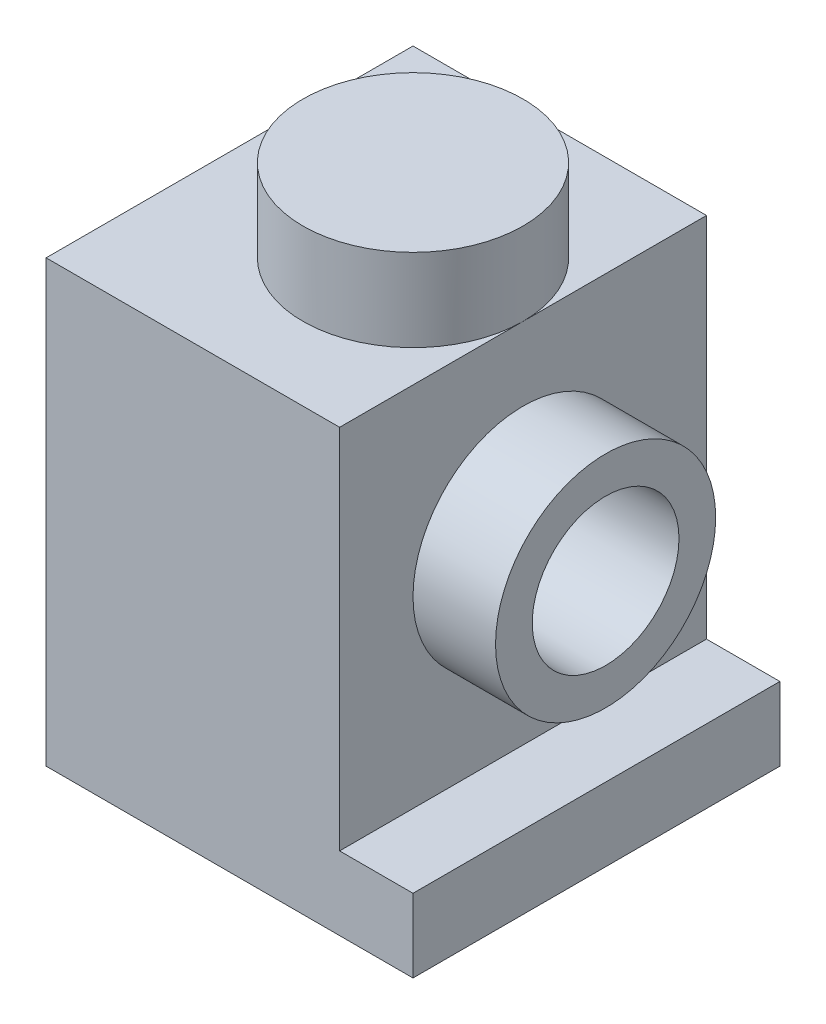
ISO-10303-21;
HEADER;
FILE_DESCRIPTION(('STEP AP214'),'2;1');
FILE_NAME('part.step','',(''),(''),'','','');
FILE_SCHEMA(('AUTOMOTIVE_DESIGN { 1 0 10303 214 1 1 1 1 }'));
ENDSEC;
DATA;
#1=APPLICATION_CONTEXT('core data for automotive mechanical design processes');
#2=APPLICATION_PROTOCOL_DEFINITION('international standard','automotive_design',2000,#1);
#3=PRODUCT_CONTEXT('',#1,'mechanical');
#4=PRODUCT('Part','Part','',(#3));
#5=PRODUCT_RELATED_PRODUCT_CATEGORY('part','',(#4));
#6=PRODUCT_DEFINITION_FORMATION('','',#4);
#7=PRODUCT_DEFINITION_CONTEXT('part definition',#1,'design');
#8=PRODUCT_DEFINITION('design','',#6,#7);
#9=PRODUCT_DEFINITION_SHAPE('','',#8);
#10=(LENGTH_UNIT() NAMED_UNIT(*) SI_UNIT(.MILLI.,.METRE.));
#11=(NAMED_UNIT(*) PLANE_ANGLE_UNIT() SI_UNIT($,.RADIAN.));
#12=(NAMED_UNIT(*) SI_UNIT($,.STERADIAN.) SOLID_ANGLE_UNIT());
#13=UNCERTAINTY_MEASURE_WITH_UNIT(LENGTH_MEASURE(1.E-05),#10,'distance_accuracy_value','');
#14=(GEOMETRIC_REPRESENTATION_CONTEXT(3) GLOBAL_UNCERTAINTY_ASSIGNED_CONTEXT((#13)) GLOBAL_UNIT_ASSIGNED_CONTEXT((#10,
#11,#12)) REPRESENTATION_CONTEXT('',''));
#15=CARTESIAN_POINT('',(0.,0.,0.));
#16=DIRECTION('',(0.,0.,1.));
#17=DIRECTION('',(1.,0.,0.));
#18=AXIS2_PLACEMENT_3D('',#15,#16,#17);
#19=CARTESIAN_POINT('',(-4.8,5.6,0.));
#20=DIRECTION('',(1.,0.,0.));
#21=DIRECTION('',(0.,0.,-1.));
#22=AXIS2_PLACEMENT_3D('',#19,#20,#21);
#23=CYLINDRICAL_SURFACE('',#22,1.6);
#24=CARTESIAN_POINT('',(4.2,5.6,0.));
#25=DIRECTION('',(1.,0.,0.));
#26=DIRECTION('',(0.,0.,-1.));
#27=AXIS2_PLACEMENT_3D('',#24,#25,#26);
#28=CIRCLE('',#27,1.6);
#29=CARTESIAN_POINT('',(4.2,5.6,-1.60000000000009));
#30=VERTEX_POINT('',#29);
#31=EDGE_CURVE('E156',#30,#30,#28,.T.);
#32=ORIENTED_EDGE('',*,*,#31,.T.);
#33=EDGE_LOOP('',(#32));
#34=FACE_BOUND('',#33,.T.);
#35=CARTESIAN_POINT('',(1.,5.6,0.));
#36=DIRECTION('',(-1.,0.,0.));
#37=DIRECTION('',(0.,0.,1.));
#38=AXIS2_PLACEMENT_3D('',#35,#36,#37);
#39=CIRCLE('',#38,1.6);
#40=CARTESIAN_POINT('',(1.,5.6,1.5999999999999));
#41=VERTEX_POINT('',#40);
#42=EDGE_CURVE('E37',#41,#41,#39,.F.);
#43=ORIENTED_EDGE('',*,*,#42,.F.);
#44=EDGE_LOOP('',(#43));
#45=FACE_BOUND('',#44,.T.);
#46=ADVANCED_FACE('F33',(#34,#45),#23,.F.);
#47=CARTESIAN_POINT('',(4.,9.6,4.));
#48=DIRECTION('',(-1.,0.,0.));
#49=DIRECTION('',(0.,0.,1.));
#50=AXIS2_PLACEMENT_3D('',#47,#48,#49);
#51=PLANE('',#50);
#52=DIRECTION('',(0.,0.,-1.));
#53=VECTOR('',#52,1.);
#54=CARTESIAN_POINT('',(4.,1.6,-4.));
#55=LINE('',#54,#53);
#56=CARTESIAN_POINT('',(4.,1.6,4.));
#57=VERTEX_POINT('',#56);
#58=CARTESIAN_POINT('',(4.,1.6,-4.));
#59=VERTEX_POINT('',#58);
#60=EDGE_CURVE('E172',#57,#59,#55,.T.);
#61=ORIENTED_EDGE('',*,*,#60,.F.);
#62=DIRECTION('',(0.,-1.,0.));
#63=VECTOR('',#62,1.);
#64=CARTESIAN_POINT('',(4.,9.6,4.));
#65=LINE('',#64,#63);
#66=CARTESIAN_POINT('',(4.,0.,4.));
#67=VERTEX_POINT('',#66);
#68=EDGE_CURVE('E206',#57,#67,#65,.T.);
#69=ORIENTED_EDGE('',*,*,#68,.T.);
#70=DIRECTION('',(0.,0.,-1.));
#71=VECTOR('',#70,1.);
#72=CARTESIAN_POINT('',(4.,0.,4.));
#73=LINE('',#72,#71);
#74=CARTESIAN_POINT('',(4.,0.,-4.));
#75=VERTEX_POINT('',#74);
#76=EDGE_CURVE('E198',#67,#75,#73,.T.);
#77=ORIENTED_EDGE('',*,*,#76,.T.);
#78=DIRECTION('',(0.,-1.,0.));
#79=VECTOR('',#78,1.);
#80=CARTESIAN_POINT('',(4.,9.6,-4.));
#81=LINE('',#80,#79);
#82=EDGE_CURVE('E204',#59,#75,#81,.T.);
#83=ORIENTED_EDGE('',*,*,#82,.F.);
#84=EDGE_LOOP('',(#61,#69,#77,#83));
#85=FACE_BOUND('',#84,.T.);
#86=ADVANCED_FACE('F225',(#85),#51,.F.);
#87=CARTESIAN_POINT('',(-4.,9.6,4.));
#88=DIRECTION('',(1.,0.,0.));
#89=DIRECTION('',(0.,0.,-1.));
#90=AXIS2_PLACEMENT_3D('',#87,#88,#89);
#91=PLANE('',#90);
#92=DIRECTION('',(0.,0.,1.));
#93=VECTOR('',#92,1.);
#94=CARTESIAN_POINT('',(-4.,3.19828034728268,2.39999999999981));
#95=LINE('',#94,#93);
#96=CARTESIAN_POINT('',(-4.,3.19828034728268,-2.4));
#97=VERTEX_POINT('',#96);
#98=CARTESIAN_POINT('',(-4.,3.19828034728268,2.39999999999981));
#99=VERTEX_POINT('',#98);
#100=EDGE_CURVE('E144',#97,#99,#95,.T.);
#101=ORIENTED_EDGE('',*,*,#100,.F.);
#102=DIRECTION('',(0.,-1.,0.));
#103=VECTOR('',#102,1.);
#104=CARTESIAN_POINT('',(-4.,3.19828034728268,-2.4));
#105=LINE('',#104,#103);
#106=CARTESIAN_POINT('',(-4.,8.00171965271731,-2.4));
#107=VERTEX_POINT('',#106);
#108=EDGE_CURVE('E49',#107,#97,#105,.T.);
#109=ORIENTED_EDGE('',*,*,#108,.F.);
#110=DIRECTION('',(0.,0.,-1.));
#111=VECTOR('',#110,1.);
#112=CARTESIAN_POINT('',(-4.,8.00171965271731,2.39999999999981));
#113=LINE('',#112,#111);
#114=CARTESIAN_POINT('',(-4.,8.00171965271731,2.39999999999981));
#115=VERTEX_POINT('',#114);
#116=EDGE_CURVE('E135',#115,#107,#113,.T.);
#117=ORIENTED_EDGE('',*,*,#116,.F.);
#118=DIRECTION('',(0.,1.,0.));
#119=VECTOR('',#118,1.);
#120=CARTESIAN_POINT('',(-4.,3.19828034728268,2.39999999999981));
#121=LINE('',#120,#119);
#122=EDGE_CURVE('E138',#99,#115,#121,.T.);
#123=ORIENTED_EDGE('',*,*,#122,.F.);
#124=EDGE_LOOP('',(#101,#109,#117,#123));
#125=FACE_BOUND('',#124,.T.);
#126=DIRECTION('',(0.,0.,1.));
#127=VECTOR('',#126,1.);
#128=CARTESIAN_POINT('',(-4.,0.,4.));
#129=LINE('',#128,#127);
#130=CARTESIAN_POINT('',(-4.,0.,-4.));
#131=VERTEX_POINT('',#130);
#132=CARTESIAN_POINT('',(-4.,0.,4.));
#133=VERTEX_POINT('',#132);
#134=EDGE_CURVE('E180',#131,#133,#129,.T.);
#135=ORIENTED_EDGE('',*,*,#134,.T.);
#136=DIRECTION('',(0.,-1.,0.));
#137=VECTOR('',#136,1.);
#138=CARTESIAN_POINT('',(-4.,9.6,4.));
#139=LINE('',#138,#137);
#140=CARTESIAN_POINT('',(-4.,9.6,4.));
#141=VERTEX_POINT('',#140);
#142=EDGE_CURVE('E42',#141,#133,#139,.T.);
#143=ORIENTED_EDGE('',*,*,#142,.F.);
#144=DIRECTION('',(0.,0.,1.));
#145=VECTOR('',#144,1.);
#146=CARTESIAN_POINT('',(-4.,9.6,4.));
#147=LINE('',#146,#145);
#148=CARTESIAN_POINT('',(-4.,9.6,-4.));
#149=VERTEX_POINT('',#148);
#150=EDGE_CURVE('E183',#149,#141,#147,.T.);
#151=ORIENTED_EDGE('',*,*,#150,.F.);
#152=DIRECTION('',(0.,-1.,0.));
#153=VECTOR('',#152,1.);
#154=CARTESIAN_POINT('',(-4.,9.6,-4.));
#155=LINE('',#154,#153);
#156=EDGE_CURVE('E192',#149,#131,#155,.T.);
#157=ORIENTED_EDGE('',*,*,#156,.T.);
#158=EDGE_LOOP('',(#135,#143,#151,#157));
#159=FACE_BOUND('',#158,.T.);
#160=ADVANCED_FACE('F35',(#125,#159),#91,.F.);
#161=CARTESIAN_POINT('',(4.,9.6,4.));
#162=DIRECTION('',(0.,0.,-1.));
#163=DIRECTION('',(-1.,0.,0.));
#164=AXIS2_PLACEMENT_3D('',#161,#162,#163);
#165=PLANE('',#164);
#166=DIRECTION('',(1.,0.,0.));
#167=VECTOR('',#166,1.);
#168=CARTESIAN_POINT('',(2.4,1.6,4.));
#169=LINE('',#168,#167);
#170=CARTESIAN_POINT('',(2.4,1.6,4.));
#171=VERTEX_POINT('',#170);
#172=EDGE_CURVE('E169',#171,#57,#169,.T.);
#173=ORIENTED_EDGE('',*,*,#172,.F.);
#174=DIRECTION('',(0.,1.,0.));
#175=VECTOR('',#174,1.);
#176=CARTESIAN_POINT('',(2.4,1.6,4.));
#177=LINE('',#176,#175);
#178=CARTESIAN_POINT('',(2.4,9.6,4.));
#179=VERTEX_POINT('',#178);
#180=EDGE_CURVE('E177',#171,#179,#177,.T.);
#181=ORIENTED_EDGE('',*,*,#180,.T.);
#182=DIRECTION('',(1.,0.,0.));
#183=VECTOR('',#182,1.);
#184=CARTESIAN_POINT('',(4.,9.6,4.));
#185=LINE('',#184,#183);
#186=EDGE_CURVE('E186',#141,#179,#185,.T.);
#187=ORIENTED_EDGE('',*,*,#186,.F.);
#188=ORIENTED_EDGE('',*,*,#142,.T.);
#189=DIRECTION('',(1.,0.,0.));
#190=VECTOR('',#189,1.);
#191=CARTESIAN_POINT('',(4.,0.,4.));
#192=LINE('',#191,#190);
#193=EDGE_CURVE('E195',#133,#67,#192,.T.);
#194=ORIENTED_EDGE('',*,*,#193,.T.);
#195=ORIENTED_EDGE('',*,*,#68,.F.);
#196=EDGE_LOOP('',(#173,#181,#187,#188,#194,#195));
#197=FACE_BOUND('',#196,.T.);
#198=ADVANCED_FACE('F212',(#197),#165,.F.);
#199=CARTESIAN_POINT('',(4.,9.6,-4.));
#200=DIRECTION('',(0.,0.,1.));
#201=DIRECTION('',(1.,0.,0.));
#202=AXIS2_PLACEMENT_3D('',#199,#200,#201);
#203=PLANE('',#202);
#204=DIRECTION('',(-1.,0.,0.));
#205=VECTOR('',#204,1.);
#206=CARTESIAN_POINT('',(4.,9.6,-4.));
#207=LINE('',#206,#205);
#208=CARTESIAN_POINT('',(2.4,9.6,-4.));
#209=VERTEX_POINT('',#208);
#210=EDGE_CURVE('E190',#209,#149,#207,.T.);
#211=ORIENTED_EDGE('',*,*,#210,.F.);
#212=DIRECTION('',(0.,1.,0.));
#213=VECTOR('',#212,1.);
#214=CARTESIAN_POINT('',(2.4,1.6,-4.));
#215=LINE('',#214,#213);
#216=CARTESIAN_POINT('',(2.4,1.6,-4.));
#217=VERTEX_POINT('',#216);
#218=EDGE_CURVE('E57',#217,#209,#215,.T.);
#219=ORIENTED_EDGE('',*,*,#218,.F.);
#220=DIRECTION('',(-1.,0.,0.));
#221=VECTOR('',#220,1.);
#222=CARTESIAN_POINT('',(2.4,1.6,-4.));
#223=LINE('',#222,#221);
#224=EDGE_CURVE('E174',#59,#217,#223,.T.);
#225=ORIENTED_EDGE('',*,*,#224,.F.);
#226=ORIENTED_EDGE('',*,*,#82,.T.);
#227=DIRECTION('',(-1.,0.,0.));
#228=VECTOR('',#227,1.);
#229=CARTESIAN_POINT('',(4.,0.,-4.));
#230=LINE('',#229,#228);
#231=EDGE_CURVE('E187',#75,#131,#230,.T.);
#232=ORIENTED_EDGE('',*,*,#231,.T.);
#233=ORIENTED_EDGE('',*,*,#156,.F.);
#234=EDGE_LOOP('',(#211,#219,#225,#226,#232,#233));
#235=FACE_BOUND('',#234,.T.);
#236=ADVANCED_FACE('F236',(#235),#203,.F.);
#237=CARTESIAN_POINT('',(0.,9.6,0.));
#238=DIRECTION('',(0.,1.,0.));
#239=DIRECTION('',(0.,0.,1.));
#240=AXIS2_PLACEMENT_3D('',#237,#238,#239);
#241=PLANE('',#240);
#242=DIRECTION('',(0.,0.,1.));
#243=VECTOR('',#242,1.);
#244=CARTESIAN_POINT('',(2.4,9.6,-4.));
#245=LINE('',#244,#243);
#246=CARTESIAN_POINT('',(2.4,9.6,0.));
#247=VERTEX_POINT('',#246);
#248=EDGE_CURVE('E165',#247,#179,#245,.T.);
#249=ORIENTED_EDGE('',*,*,#248,.F.);
#250=CARTESIAN_POINT('',(0.,9.6,0.));
#251=DIRECTION('',(0.,1.,0.));
#252=DIRECTION('',(0.,0.,1.));
#253=AXIS2_PLACEMENT_3D('',#250,#251,#252);
#254=CIRCLE('',#253,2.4);
#255=EDGE_CURVE('E157',#247,#247,#254,.T.);
#256=ORIENTED_EDGE('',*,*,#255,.F.);
#257=EDGE_CURVE('E170',#209,#247,#245,.T.);
#258=ORIENTED_EDGE('',*,*,#257,.F.);
#259=ORIENTED_EDGE('',*,*,#210,.T.);
#260=ORIENTED_EDGE('',*,*,#150,.T.);
#261=ORIENTED_EDGE('',*,*,#186,.T.);
#262=EDGE_LOOP('',(#249,#256,#258,#259,#260,#261));
#263=FACE_BOUND('',#262,.T.);
#264=ADVANCED_FACE('F233',(#263),#241,.T.);
#265=CARTESIAN_POINT('',(0.,0.,0.));
#266=DIRECTION('',(0.,1.,0.));
#267=DIRECTION('',(0.,0.,1.));
#268=AXIS2_PLACEMENT_3D('',#265,#266,#267);
#269=PLANE('',#268);
#270=ORIENTED_EDGE('',*,*,#134,.F.);
#271=ORIENTED_EDGE('',*,*,#231,.F.);
#272=ORIENTED_EDGE('',*,*,#76,.F.);
#273=ORIENTED_EDGE('',*,*,#193,.F.);
#274=EDGE_LOOP('',(#270,#271,#272,#273));
#275=FACE_BOUND('',#274,.T.);
#276=ADVANCED_FACE('F221',(#275),#269,.F.);
#277=CARTESIAN_POINT('',(2.4,1.6,-4.));
#278=DIRECTION('',(-1.,0.,0.));
#279=DIRECTION('',(0.,0.,1.));
#280=AXIS2_PLACEMENT_3D('',#277,#278,#279);
#281=PLANE('',#280);
#282=CARTESIAN_POINT('',(2.4,5.6,0.));
#283=DIRECTION('',(-1.,0.,0.));
#284=DIRECTION('',(0.,0.,1.));
#285=AXIS2_PLACEMENT_3D('',#282,#283,#284);
#286=CIRCLE('',#285,2.4);
#287=CARTESIAN_POINT('',(2.4,5.6,2.3999999999999));
#288=VERTEX_POINT('',#287);
#289=EDGE_CURVE('E11',#288,#288,#286,.F.);
#290=ORIENTED_EDGE('',*,*,#289,.F.);
#291=EDGE_LOOP('',(#290));
#292=FACE_BOUND('',#291,.T.);
#293=ORIENTED_EDGE('',*,*,#257,.T.);
#294=ORIENTED_EDGE('',*,*,#248,.T.);
#295=ORIENTED_EDGE('',*,*,#180,.F.);
#296=DIRECTION('',(0.,0.,1.));
#297=VECTOR('',#296,1.);
#298=CARTESIAN_POINT('',(2.4,1.6,-4.));
#299=LINE('',#298,#297);
#300=EDGE_CURVE('E166',#217,#171,#299,.T.);
#301=ORIENTED_EDGE('',*,*,#300,.F.);
#302=ORIENTED_EDGE('',*,*,#218,.T.);
#303=EDGE_LOOP('',(#293,#294,#295,#301,#302));
#304=FACE_BOUND('',#303,.T.);
#305=ADVANCED_FACE('F229',(#292,#304),#281,.F.);
#306=CARTESIAN_POINT('',(0.,1.6,0.));
#307=DIRECTION('',(0.,1.,0.));
#308=DIRECTION('',(0.,0.,1.));
#309=AXIS2_PLACEMENT_3D('',#306,#307,#308);
#310=PLANE('',#309);
#311=ORIENTED_EDGE('',*,*,#300,.T.);
#312=ORIENTED_EDGE('',*,*,#172,.T.);
#313=ORIENTED_EDGE('',*,*,#60,.T.);
#314=ORIENTED_EDGE('',*,*,#224,.T.);
#315=EDGE_LOOP('',(#311,#312,#313,#314));
#316=FACE_BOUND('',#315,.T.);
#317=ADVANCED_FACE('F227',(#316),#310,.T.);
#318=CARTESIAN_POINT('',(4.2,5.6,0.));
#319=DIRECTION('',(-1.,0.,0.));
#320=DIRECTION('',(0.,0.,1.));
#321=AXIS2_PLACEMENT_3D('',#318,#319,#320);
#322=CYLINDRICAL_SURFACE('',#321,2.4);
#323=CARTESIAN_POINT('',(4.2,5.6,0.));
#324=DIRECTION('',(1.,0.,0.));
#325=DIRECTION('',(0.,0.,-1.));
#326=AXIS2_PLACEMENT_3D('',#323,#324,#325);
#327=CIRCLE('',#326,2.4);
#328=CARTESIAN_POINT('',(4.2,5.6,-2.4000000000001));
#329=VERTEX_POINT('',#328);
#330=EDGE_CURVE('E162',#329,#329,#327,.T.);
#331=ORIENTED_EDGE('',*,*,#330,.F.);
#332=EDGE_LOOP('',(#331));
#333=FACE_BOUND('',#332,.T.);
#334=ORIENTED_EDGE('',*,*,#289,.T.);
#335=EDGE_LOOP('',(#334));
#336=FACE_BOUND('',#335,.T.);
#337=ADVANCED_FACE('F260',(#333,#336),#322,.T.);
#338=CARTESIAN_POINT('',(4.2,5.6,0.));
#339=DIRECTION('',(1.,0.,0.));
#340=DIRECTION('',(0.,0.,-1.));
#341=AXIS2_PLACEMENT_3D('',#338,#339,#340);
#342=PLANE('',#341);
#343=ORIENTED_EDGE('',*,*,#31,.F.);
#344=EDGE_LOOP('',(#343));
#345=FACE_BOUND('',#344,.T.);
#346=ORIENTED_EDGE('',*,*,#330,.T.);
#347=EDGE_LOOP('',(#346));
#348=FACE_BOUND('',#347,.T.);
#349=ADVANCED_FACE('F257',(#345,#348),#342,.T.);
#350=CARTESIAN_POINT('',(0.,11.4,0.));
#351=DIRECTION('',(0.,-1.,0.));
#352=DIRECTION('',(0.,0.,-1.));
#353=AXIS2_PLACEMENT_3D('',#350,#351,#352);
#354=CYLINDRICAL_SURFACE('',#353,2.4);
#355=CARTESIAN_POINT('',(0.,11.4,0.));
#356=DIRECTION('',(0.,1.,0.));
#357=DIRECTION('',(0.,0.,1.));
#358=AXIS2_PLACEMENT_3D('',#355,#356,#357);
#359=CIRCLE('',#358,2.4);
#360=CARTESIAN_POINT('',(0.,11.4,2.4));
#361=VERTEX_POINT('',#360);
#362=EDGE_CURVE('E153',#361,#361,#359,.T.);
#363=ORIENTED_EDGE('',*,*,#362,.F.);
#364=EDGE_LOOP('',(#363));
#365=FACE_BOUND('',#364,.T.);
#366=ORIENTED_EDGE('',*,*,#255,.T.);
#367=EDGE_LOOP('',(#366));
#368=FACE_BOUND('',#367,.T.);
#369=ADVANCED_FACE('F255',(#365,#368),#354,.T.);
#370=CARTESIAN_POINT('',(0.,11.4,0.));
#371=DIRECTION('',(0.,1.,0.));
#372=DIRECTION('',(0.,0.,1.));
#373=AXIS2_PLACEMENT_3D('',#370,#371,#372);
#374=PLANE('',#373);
#375=ORIENTED_EDGE('',*,*,#362,.T.);
#376=EDGE_LOOP('',(#375));
#377=FACE_BOUND('',#376,.T.);
#378=ADVANCED_FACE('F297',(#377),#374,.T.);
#379=CARTESIAN_POINT('',(1.,0.,0.));
#380=DIRECTION('',(-1.,0.,0.));
#381=DIRECTION('',(0.,0.,1.));
#382=AXIS2_PLACEMENT_3D('',#379,#380,#381);
#383=PLANE('',#382);
#384=DIRECTION('',(0.,-1.,0.));
#385=VECTOR('',#384,1.);
#386=CARTESIAN_POINT('',(1.,3.19828034728268,-2.4));
#387=LINE('',#386,#385);
#388=CARTESIAN_POINT('',(1.,8.00171965271731,-2.4));
#389=VERTEX_POINT('',#388);
#390=CARTESIAN_POINT('',(1.,3.19828034728268,-2.4));
#391=VERTEX_POINT('',#390);
#392=EDGE_CURVE('E116',#389,#391,#387,.T.);
#393=ORIENTED_EDGE('',*,*,#392,.T.);
#394=DIRECTION('',(0.,0.,1.));
#395=VECTOR('',#394,1.);
#396=CARTESIAN_POINT('',(1.,3.19828034728268,2.39999999999981));
#397=LINE('',#396,#395);
#398=CARTESIAN_POINT('',(1.,3.19828034728268,2.39999999999981));
#399=VERTEX_POINT('',#398);
#400=EDGE_CURVE('E125',#391,#399,#397,.T.);
#401=ORIENTED_EDGE('',*,*,#400,.T.);
#402=DIRECTION('',(0.,1.,0.));
#403=VECTOR('',#402,1.);
#404=CARTESIAN_POINT('',(1.,3.19828034728268,2.39999999999981));
#405=LINE('',#404,#403);
#406=CARTESIAN_POINT('',(1.,8.00171965271731,2.39999999999981));
#407=VERTEX_POINT('',#406);
#408=EDGE_CURVE('E130',#399,#407,#405,.T.);
#409=ORIENTED_EDGE('',*,*,#408,.T.);
#410=DIRECTION('',(0.,0.,-1.));
#411=VECTOR('',#410,1.);
#412=CARTESIAN_POINT('',(1.,8.00171965271731,2.39999999999981));
#413=LINE('',#412,#411);
#414=EDGE_CURVE('E122',#407,#389,#413,.T.);
#415=ORIENTED_EDGE('',*,*,#414,.T.);
#416=EDGE_LOOP('',(#393,#401,#409,#415));
#417=FACE_BOUND('',#416,.T.);
#418=ORIENTED_EDGE('',*,*,#42,.T.);
#419=EDGE_LOOP('',(#418));
#420=FACE_BOUND('',#419,.T.);
#421=ADVANCED_FACE('F132',(#417,#420),#383,.T.);
#422=CARTESIAN_POINT('',(1.,3.19828034728268,-2.4));
#423=DIRECTION('',(0.,0.,-1.));
#424=DIRECTION('',(-1.,0.,0.));
#425=AXIS2_PLACEMENT_3D('',#422,#423,#424);
#426=PLANE('',#425);
#427=ORIENTED_EDGE('',*,*,#108,.T.);
#428=DIRECTION('',(-1.,0.,0.));
#429=VECTOR('',#428,1.);
#430=CARTESIAN_POINT('',(1.,3.19828034728268,-2.4));
#431=LINE('',#430,#429);
#432=EDGE_CURVE('E112',#391,#97,#431,.T.);
#433=ORIENTED_EDGE('',*,*,#432,.F.);
#434=ORIENTED_EDGE('',*,*,#392,.F.);
#435=DIRECTION('',(-1.,0.,0.));
#436=VECTOR('',#435,1.);
#437=CARTESIAN_POINT('',(1.,8.00171965271731,-2.4));
#438=LINE('',#437,#436);
#439=EDGE_CURVE('E148',#389,#107,#438,.T.);
#440=ORIENTED_EDGE('',*,*,#439,.T.);
#441=EDGE_LOOP('',(#427,#433,#434,#440));
#442=FACE_BOUND('',#441,.T.);
#443=ADVANCED_FACE('F114',(#442),#426,.F.);
#444=CARTESIAN_POINT('',(1.,8.00171965271731,2.39999999999981));
#445=DIRECTION('',(0.,1.,0.));
#446=DIRECTION('',(0.,0.,1.));
#447=AXIS2_PLACEMENT_3D('',#444,#445,#446);
#448=PLANE('',#447);
#449=ORIENTED_EDGE('',*,*,#116,.T.);
#450=ORIENTED_EDGE('',*,*,#439,.F.);
#451=ORIENTED_EDGE('',*,*,#414,.F.);
#452=DIRECTION('',(-1.,0.,0.));
#453=VECTOR('',#452,1.);
#454=CARTESIAN_POINT('',(1.,8.00171965271731,2.39999999999981));
#455=LINE('',#454,#453);
#456=EDGE_CURVE('E150',#407,#115,#455,.T.);
#457=ORIENTED_EDGE('',*,*,#456,.T.);
#458=EDGE_LOOP('',(#449,#450,#451,#457));
#459=FACE_BOUND('',#458,.T.);
#460=ADVANCED_FACE('F317',(#459),#448,.F.);
#461=CARTESIAN_POINT('',(1.,3.19828034728268,2.39999999999981));
#462=DIRECTION('',(0.,0.,1.));
#463=DIRECTION('',(1.,0.,0.));
#464=AXIS2_PLACEMENT_3D('',#461,#462,#463);
#465=PLANE('',#464);
#466=ORIENTED_EDGE('',*,*,#122,.T.);
#467=ORIENTED_EDGE('',*,*,#456,.F.);
#468=ORIENTED_EDGE('',*,*,#408,.F.);
#469=DIRECTION('',(-1.,0.,0.));
#470=VECTOR('',#469,1.);
#471=CARTESIAN_POINT('',(1.,3.19828034728268,2.39999999999981));
#472=LINE('',#471,#470);
#473=EDGE_CURVE('E121',#399,#99,#472,.T.);
#474=ORIENTED_EDGE('',*,*,#473,.T.);
#475=EDGE_LOOP('',(#466,#467,#468,#474));
#476=FACE_BOUND('',#475,.T.);
#477=ADVANCED_FACE('F324',(#476),#465,.F.);
#478=CARTESIAN_POINT('',(1.,3.19828034728268,2.39999999999981));
#479=DIRECTION('',(0.,-1.,0.));
#480=DIRECTION('',(0.,0.,-1.));
#481=AXIS2_PLACEMENT_3D('',#478,#479,#480);
#482=PLANE('',#481);
#483=ORIENTED_EDGE('',*,*,#100,.T.);
#484=ORIENTED_EDGE('',*,*,#473,.F.);
#485=ORIENTED_EDGE('',*,*,#400,.F.);
#486=ORIENTED_EDGE('',*,*,#432,.T.);
#487=EDGE_LOOP('',(#483,#484,#485,#486));
#488=FACE_BOUND('',#487,.T.);
#489=ADVANCED_FACE('F126',(#488),#482,.F.);
#490=CLOSED_SHELL('',(#46,#86,#160,#198,#236,#264,#276,#305,#317,#337,#349,#369,#378,#421,#443,
#460,#477,#489));
#491=MANIFOLD_SOLID_BREP('B2',#490);
#492=ADVANCED_BREP_SHAPE_REPRESENTATION('',(#18,#491),#14);
#493=SHAPE_DEFINITION_REPRESENTATION(#9,#492);
ENDSEC;
END-ISO-10303-21;
